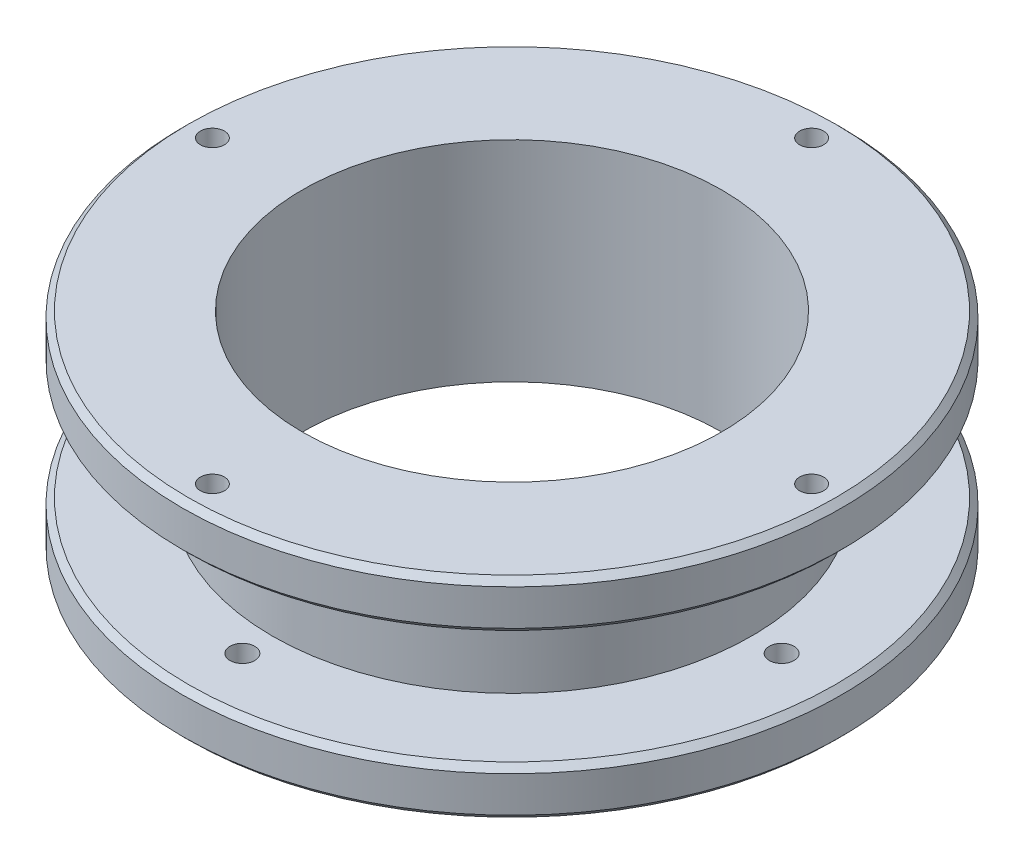
ISO-10303-21;
HEADER;
FILE_DESCRIPTION(('STEP AP214'),'2;1');
FILE_NAME('part.step','',(''),(''),'','','');
FILE_SCHEMA(('AUTOMOTIVE_DESIGN { 1 0 10303 214 1 1 1 1 }'));
ENDSEC;
DATA;
#1=APPLICATION_CONTEXT('core data for automotive mechanical design processes');
#2=APPLICATION_PROTOCOL_DEFINITION('international standard','automotive_design',2000,#1);
#3=PRODUCT_CONTEXT('',#1,'mechanical');
#4=PRODUCT('Part','Part','',(#3));
#5=PRODUCT_RELATED_PRODUCT_CATEGORY('part','',(#4));
#6=PRODUCT_DEFINITION_FORMATION('','',#4);
#7=PRODUCT_DEFINITION_CONTEXT('part definition',#1,'design');
#8=PRODUCT_DEFINITION('design','',#6,#7);
#9=PRODUCT_DEFINITION_SHAPE('','',#8);
#10=(LENGTH_UNIT() NAMED_UNIT(*) SI_UNIT(.MILLI.,.METRE.));
#11=(NAMED_UNIT(*) PLANE_ANGLE_UNIT() SI_UNIT($,.RADIAN.));
#12=(NAMED_UNIT(*) SI_UNIT($,.STERADIAN.) SOLID_ANGLE_UNIT());
#13=UNCERTAINTY_MEASURE_WITH_UNIT(LENGTH_MEASURE(1.E-05),#10,'distance_accuracy_value','');
#14=(GEOMETRIC_REPRESENTATION_CONTEXT(3) GLOBAL_UNCERTAINTY_ASSIGNED_CONTEXT((#13)) GLOBAL_UNIT_ASSIGNED_CONTEXT((#10,
#11,#12)) REPRESENTATION_CONTEXT('',''));
#15=CARTESIAN_POINT('',(0.,0.,0.));
#16=DIRECTION('',(0.,0.,1.));
#17=DIRECTION('',(1.,0.,0.));
#18=AXIS2_PLACEMENT_3D('',#15,#16,#17);
#19=CARTESIAN_POINT('',(0.,17.5,0.));
#20=DIRECTION('',(0.,-1.,0.));
#21=DIRECTION('',(0.,0.,-1.));
#22=AXIS2_PLACEMENT_3D('',#19,#20,#21);
#23=CYLINDRICAL_SURFACE('',#22,40.);
#24=CARTESIAN_POINT('',(0.,8.,0.));
#25=DIRECTION('',(0.,-1.,0.));
#26=DIRECTION('',(1.,0.,0.));
#27=AXIS2_PLACEMENT_3D('',#24,#25,#26);
#28=CIRCLE('',#27,40.);
#29=CARTESIAN_POINT('',(0.,8.,40.));
#30=VERTEX_POINT('',#29);
#31=EDGE_CURVE('E325',#30,#30,#28,.T.);
#32=ORIENTED_EDGE('',*,*,#31,.F.);
#33=DIRECTION('',(0.,1.,0.));
#34=VECTOR('',#33,1.);
#35=CARTESIAN_POINT('',(0.,17.5,40.));
#36=LINE('',#35,#34);
#37=CARTESIAN_POINT('',(0.,27.,40.));
#38=VERTEX_POINT('',#37);
#39=EDGE_CURVE('E10',#30,#38,#36,.T.);
#40=ORIENTED_EDGE('',*,*,#39,.T.);
#41=CARTESIAN_POINT('',(0.,27.,0.));
#42=DIRECTION('',(0.,-1.,0.));
#43=DIRECTION('',(1.,0.,0.));
#44=AXIS2_PLACEMENT_3D('',#41,#42,#43);
#45=CIRCLE('',#44,40.);
#46=EDGE_CURVE('E194',#38,#38,#45,.T.);
#47=ORIENTED_EDGE('',*,*,#46,.T.);
#48=ORIENTED_EDGE('',*,*,#39,.F.);
#49=EDGE_LOOP('',(#32,#40,#47,#48));
#50=FACE_BOUND('',#49,.T.);
#51=ADVANCED_FACE('F16',(#50),#23,.T.);
#52=CARTESIAN_POINT('',(0.,17.5,0.));
#53=DIRECTION('',(0.,-1.,0.));
#54=DIRECTION('',(0.,0.,-1.));
#55=AXIS2_PLACEMENT_3D('',#52,#53,#54);
#56=CYLINDRICAL_SURFACE('',#55,35.);
#57=CARTESIAN_POINT('',(0.,0.,0.));
#58=DIRECTION('',(0.,-1.,0.));
#59=DIRECTION('',(1.,0.,0.));
#60=AXIS2_PLACEMENT_3D('',#57,#58,#59);
#61=CIRCLE('',#60,35.);
#62=CARTESIAN_POINT('',(0.,0.,35.));
#63=VERTEX_POINT('',#62);
#64=EDGE_CURVE('E210',#63,#63,#61,.T.);
#65=ORIENTED_EDGE('',*,*,#64,.T.);
#66=DIRECTION('',(0.,1.,0.));
#67=VECTOR('',#66,1.);
#68=CARTESIAN_POINT('',(0.,17.5,35.));
#69=LINE('',#68,#67);
#70=CARTESIAN_POINT('',(0.,35.,35.));
#71=VERTEX_POINT('',#70);
#72=EDGE_CURVE('E26',#63,#71,#69,.T.);
#73=ORIENTED_EDGE('',*,*,#72,.T.);
#74=CARTESIAN_POINT('',(0.,35.,0.));
#75=DIRECTION('',(0.,-1.,0.));
#76=DIRECTION('',(1.,0.,0.));
#77=AXIS2_PLACEMENT_3D('',#74,#75,#76);
#78=CIRCLE('',#77,35.);
#79=EDGE_CURVE('E311',#71,#71,#78,.T.);
#80=ORIENTED_EDGE('',*,*,#79,.F.);
#81=ORIENTED_EDGE('',*,*,#72,.F.);
#82=EDGE_LOOP('',(#65,#73,#80,#81));
#83=FACE_BOUND('',#82,.T.);
#84=ADVANCED_FACE('F380',(#83),#56,.F.);
#85=CARTESIAN_POINT('',(0.,-124.45218719102,-50.));
#86=DIRECTION('',(0.,1.,0.));
#87=DIRECTION('',(1.,0.,0.));
#88=AXIS2_PLACEMENT_3D('',#85,#86,#87);
#89=CYLINDRICAL_SURFACE('',#88,2.);
#90=CARTESIAN_POINT('',(0.,35.,-50.));
#91=DIRECTION('',(0.,-1.,0.));
#92=DIRECTION('',(1.,0.,0.));
#93=AXIS2_PLACEMENT_3D('',#90,#91,#92);
#94=CIRCLE('',#93,2.);
#95=CARTESIAN_POINT('',(-2.,35.,-50.));
#96=VERTEX_POINT('',#95);
#97=EDGE_CURVE('E185',#96,#96,#94,.T.);
#98=ORIENTED_EDGE('',*,*,#97,.F.);
#99=DIRECTION('',(0.,-1.,0.));
#100=VECTOR('',#99,1.);
#101=CARTESIAN_POINT('',(-2.,-124.45218719102,-50.));
#102=LINE('',#101,#100);
#103=CARTESIAN_POINT('',(-2.,27.,-50.));
#104=VERTEX_POINT('',#103);
#105=EDGE_CURVE('E180',#96,#104,#102,.T.);
#106=ORIENTED_EDGE('',*,*,#105,.T.);
#107=CARTESIAN_POINT('',(0.,27.,-50.));
#108=DIRECTION('',(0.,1.,0.));
#109=DIRECTION('',(1.,0.,0.));
#110=AXIS2_PLACEMENT_3D('',#107,#108,#109);
#111=CIRCLE('',#110,2.);
#112=EDGE_CURVE('E183',#104,#104,#111,.T.);
#113=ORIENTED_EDGE('',*,*,#112,.F.);
#114=ORIENTED_EDGE('',*,*,#105,.F.);
#115=EDGE_LOOP('',(#98,#106,#113,#114));
#116=FACE_BOUND('',#115,.T.);
#117=ADVANCED_FACE('F182',(#116),#89,.F.);
#118=CARTESIAN_POINT('',(0.,-124.45218719102,50.));
#119=DIRECTION('',(0.,1.,0.));
#120=DIRECTION('',(1.,0.,0.));
#121=AXIS2_PLACEMENT_3D('',#118,#119,#120);
#122=CYLINDRICAL_SURFACE('',#121,2.);
#123=CARTESIAN_POINT('',(0.,35.,50.));
#124=DIRECTION('',(0.,-1.,0.));
#125=DIRECTION('',(1.,0.,0.));
#126=AXIS2_PLACEMENT_3D('',#123,#124,#125);
#127=CIRCLE('',#126,2.);
#128=CARTESIAN_POINT('',(-2.,35.,50.));
#129=VERTEX_POINT('',#128);
#130=EDGE_CURVE('E278',#129,#129,#127,.T.);
#131=ORIENTED_EDGE('',*,*,#130,.F.);
#132=DIRECTION('',(0.,-1.,0.));
#133=VECTOR('',#132,1.);
#134=CARTESIAN_POINT('',(-2.,-124.45218719102,50.));
#135=LINE('',#134,#133);
#136=CARTESIAN_POINT('',(-2.,27.,50.));
#137=VERTEX_POINT('',#136);
#138=EDGE_CURVE('E187',#129,#137,#135,.T.);
#139=ORIENTED_EDGE('',*,*,#138,.T.);
#140=CARTESIAN_POINT('',(0.,27.,50.));
#141=DIRECTION('',(0.,1.,0.));
#142=DIRECTION('',(1.,0.,0.));
#143=AXIS2_PLACEMENT_3D('',#140,#141,#142);
#144=CIRCLE('',#143,2.);
#145=EDGE_CURVE('E193',#137,#137,#144,.T.);
#146=ORIENTED_EDGE('',*,*,#145,.F.);
#147=ORIENTED_EDGE('',*,*,#138,.F.);
#148=EDGE_LOOP('',(#131,#139,#146,#147));
#149=FACE_BOUND('',#148,.T.);
#150=ADVANCED_FACE('F435',(#149),#122,.F.);
#151=CARTESIAN_POINT('',(-50.,-124.45218719102,0.));
#152=DIRECTION('',(0.,1.,0.));
#153=DIRECTION('',(1.,0.,0.));
#154=AXIS2_PLACEMENT_3D('',#151,#152,#153);
#155=CYLINDRICAL_SURFACE('',#154,2.);
#156=CARTESIAN_POINT('',(-50.,35.,0.));
#157=DIRECTION('',(0.,-1.,0.));
#158=DIRECTION('',(1.,0.,0.));
#159=AXIS2_PLACEMENT_3D('',#156,#157,#158);
#160=CIRCLE('',#159,2.);
#161=CARTESIAN_POINT('',(-52.,35.,0.));
#162=VERTEX_POINT('',#161);
#163=EDGE_CURVE('E208',#162,#162,#160,.T.);
#164=ORIENTED_EDGE('',*,*,#163,.F.);
#165=DIRECTION('',(0.,-1.,0.));
#166=VECTOR('',#165,1.);
#167=CARTESIAN_POINT('',(-52.,-124.45218719102,0.));
#168=LINE('',#167,#166);
#169=CARTESIAN_POINT('',(-52.,27.,0.));
#170=VERTEX_POINT('',#169);
#171=EDGE_CURVE('E294',#162,#170,#168,.T.);
#172=ORIENTED_EDGE('',*,*,#171,.T.);
#173=CARTESIAN_POINT('',(-50.,27.,0.));
#174=DIRECTION('',(0.,1.,0.));
#175=DIRECTION('',(1.,0.,0.));
#176=AXIS2_PLACEMENT_3D('',#173,#174,#175);
#177=CIRCLE('',#176,2.);
#178=EDGE_CURVE('E202',#170,#170,#177,.T.);
#179=ORIENTED_EDGE('',*,*,#178,.F.);
#180=ORIENTED_EDGE('',*,*,#171,.F.);
#181=EDGE_LOOP('',(#164,#172,#179,#180));
#182=FACE_BOUND('',#181,.T.);
#183=ADVANCED_FACE('F428',(#182),#155,.F.);
#184=CARTESIAN_POINT('',(50.,-124.45218719102,0.));
#185=DIRECTION('',(0.,1.,0.));
#186=DIRECTION('',(1.,0.,0.));
#187=AXIS2_PLACEMENT_3D('',#184,#185,#186);
#188=CYLINDRICAL_SURFACE('',#187,2.);
#189=CARTESIAN_POINT('',(50.,35.,0.));
#190=DIRECTION('',(0.,-1.,0.));
#191=DIRECTION('',(1.,0.,0.));
#192=AXIS2_PLACEMENT_3D('',#189,#190,#191);
#193=CIRCLE('',#192,2.);
#194=CARTESIAN_POINT('',(48.,35.,0.));
#195=VERTEX_POINT('',#194);
#196=EDGE_CURVE('E290',#195,#195,#193,.T.);
#197=ORIENTED_EDGE('',*,*,#196,.F.);
#198=DIRECTION('',(0.,-1.,0.));
#199=VECTOR('',#198,1.);
#200=CARTESIAN_POINT('',(48.,-124.45218719102,0.));
#201=LINE('',#200,#199);
#202=CARTESIAN_POINT('',(48.,27.,0.));
#203=VERTEX_POINT('',#202);
#204=EDGE_CURVE('E40',#195,#203,#201,.T.);
#205=ORIENTED_EDGE('',*,*,#204,.T.);
#206=CARTESIAN_POINT('',(50.,27.,0.));
#207=DIRECTION('',(0.,1.,0.));
#208=DIRECTION('',(1.,0.,0.));
#209=AXIS2_PLACEMENT_3D('',#206,#207,#208);
#210=CIRCLE('',#209,2.);
#211=EDGE_CURVE('E324',#203,#203,#210,.T.);
#212=ORIENTED_EDGE('',*,*,#211,.F.);
#213=ORIENTED_EDGE('',*,*,#204,.F.);
#214=EDGE_LOOP('',(#197,#205,#212,#213));
#215=FACE_BOUND('',#214,.T.);
#216=ADVANCED_FACE('F425',(#215),#188,.F.);
#217=CARTESIAN_POINT('',(0.,159.45218719102,45.));
#218=DIRECTION('',(0.,-1.,0.));
#219=DIRECTION('',(1.,0.,0.));
#220=AXIS2_PLACEMENT_3D('',#217,#218,#219);
#221=CYLINDRICAL_SURFACE('',#220,2.067);
#222=CARTESIAN_POINT('',(0.,0.,45.));
#223=DIRECTION('',(0.,1.,0.));
#224=DIRECTION('',(1.,0.,0.));
#225=AXIS2_PLACEMENT_3D('',#222,#223,#224);
#226=CIRCLE('',#225,2.067);
#227=CARTESIAN_POINT('',(-2.067,0.,45.));
#228=VERTEX_POINT('',#227);
#229=EDGE_CURVE('E212',#228,#228,#226,.T.);
#230=ORIENTED_EDGE('',*,*,#229,.F.);
#231=DIRECTION('',(0.,1.,0.));
#232=VECTOR('',#231,1.);
#233=CARTESIAN_POINT('',(-2.067,159.45218719102,45.));
#234=LINE('',#233,#232);
#235=CARTESIAN_POINT('',(-2.067,8.,45.));
#236=VERTEX_POINT('',#235);
#237=EDGE_CURVE('E250',#228,#236,#234,.T.);
#238=ORIENTED_EDGE('',*,*,#237,.T.);
#239=CARTESIAN_POINT('',(0.,8.,45.));
#240=DIRECTION('',(0.,-1.,0.));
#241=DIRECTION('',(1.,0.,0.));
#242=AXIS2_PLACEMENT_3D('',#239,#240,#241);
#243=CIRCLE('',#242,2.067);
#244=EDGE_CURVE('E287',#236,#236,#243,.T.);
#245=ORIENTED_EDGE('',*,*,#244,.F.);
#246=ORIENTED_EDGE('',*,*,#237,.F.);
#247=EDGE_LOOP('',(#230,#238,#245,#246));
#248=FACE_BOUND('',#247,.T.);
#249=ADVANCED_FACE('F427',(#248),#221,.F.);
#250=CARTESIAN_POINT('',(0.,159.45218719102,-45.));
#251=DIRECTION('',(0.,-1.,0.));
#252=DIRECTION('',(1.,0.,0.));
#253=AXIS2_PLACEMENT_3D('',#250,#251,#252);
#254=CYLINDRICAL_SURFACE('',#253,2.067);
#255=CARTESIAN_POINT('',(0.,0.,-45.));
#256=DIRECTION('',(0.,1.,0.));
#257=DIRECTION('',(1.,0.,0.));
#258=AXIS2_PLACEMENT_3D('',#255,#256,#257);
#259=CIRCLE('',#258,2.067);
#260=CARTESIAN_POINT('',(-2.067,0.,-45.));
#261=VERTEX_POINT('',#260);
#262=EDGE_CURVE('E220',#261,#261,#259,.T.);
#263=ORIENTED_EDGE('',*,*,#262,.F.);
#264=DIRECTION('',(0.,1.,0.));
#265=VECTOR('',#264,1.);
#266=CARTESIAN_POINT('',(-2.067,159.45218719102,-45.));
#267=LINE('',#266,#265);
#268=CARTESIAN_POINT('',(-2.067,8.,-45.));
#269=VERTEX_POINT('',#268);
#270=EDGE_CURVE('E248',#261,#269,#267,.T.);
#271=ORIENTED_EDGE('',*,*,#270,.T.);
#272=CARTESIAN_POINT('',(0.,8.,-45.));
#273=DIRECTION('',(0.,-1.,0.));
#274=DIRECTION('',(1.,0.,0.));
#275=AXIS2_PLACEMENT_3D('',#272,#273,#274);
#276=CIRCLE('',#275,2.067);
#277=EDGE_CURVE('E282',#269,#269,#276,.T.);
#278=ORIENTED_EDGE('',*,*,#277,.F.);
#279=ORIENTED_EDGE('',*,*,#270,.F.);
#280=EDGE_LOOP('',(#263,#271,#278,#279));
#281=FACE_BOUND('',#280,.T.);
#282=ADVANCED_FACE('F423',(#281),#254,.F.);
#283=CARTESIAN_POINT('',(-45.,159.45218719102,0.));
#284=DIRECTION('',(0.,-1.,0.));
#285=DIRECTION('',(1.,0.,0.));
#286=AXIS2_PLACEMENT_3D('',#283,#284,#285);
#287=CYLINDRICAL_SURFACE('',#286,2.067);
#288=CARTESIAN_POINT('',(-45.,0.,0.));
#289=DIRECTION('',(0.,1.,0.));
#290=DIRECTION('',(1.,0.,0.));
#291=AXIS2_PLACEMENT_3D('',#288,#289,#290);
#292=CIRCLE('',#291,2.067);
#293=CARTESIAN_POINT('',(-47.067,0.,0.));
#294=VERTEX_POINT('',#293);
#295=EDGE_CURVE('E240',#294,#294,#292,.T.);
#296=ORIENTED_EDGE('',*,*,#295,.F.);
#297=DIRECTION('',(0.,1.,0.));
#298=VECTOR('',#297,1.);
#299=CARTESIAN_POINT('',(-47.067,159.45218719102,0.));
#300=LINE('',#299,#298);
#301=CARTESIAN_POINT('',(-47.067,8.,0.));
#302=VERTEX_POINT('',#301);
#303=EDGE_CURVE('E235',#294,#302,#300,.T.);
#304=ORIENTED_EDGE('',*,*,#303,.T.);
#305=CARTESIAN_POINT('',(-45.,8.,0.));
#306=DIRECTION('',(0.,-1.,0.));
#307=DIRECTION('',(1.,0.,0.));
#308=AXIS2_PLACEMENT_3D('',#305,#306,#307);
#309=CIRCLE('',#308,2.067);
#310=EDGE_CURVE('E286',#302,#302,#309,.T.);
#311=ORIENTED_EDGE('',*,*,#310,.F.);
#312=ORIENTED_EDGE('',*,*,#303,.F.);
#313=EDGE_LOOP('',(#296,#304,#311,#312));
#314=FACE_BOUND('',#313,.T.);
#315=ADVANCED_FACE('F420',(#314),#287,.F.);
#316=CARTESIAN_POINT('',(45.,159.45218719102,0.));
#317=DIRECTION('',(0.,-1.,0.));
#318=DIRECTION('',(1.,0.,0.));
#319=AXIS2_PLACEMENT_3D('',#316,#317,#318);
#320=CYLINDRICAL_SURFACE('',#319,2.067);
#321=CARTESIAN_POINT('',(45.,0.,0.));
#322=DIRECTION('',(0.,1.,0.));
#323=DIRECTION('',(1.,0.,0.));
#324=AXIS2_PLACEMENT_3D('',#321,#322,#323);
#325=CIRCLE('',#324,2.067);
#326=CARTESIAN_POINT('',(42.933,0.,0.));
#327=VERTEX_POINT('',#326);
#328=EDGE_CURVE('E269',#327,#327,#325,.T.);
#329=ORIENTED_EDGE('',*,*,#328,.F.);
#330=DIRECTION('',(0.,1.,0.));
#331=VECTOR('',#330,1.);
#332=CARTESIAN_POINT('',(42.933,159.45218719102,0.));
#333=LINE('',#332,#331);
#334=CARTESIAN_POINT('',(42.933,8.,0.));
#335=VERTEX_POINT('',#334);
#336=EDGE_CURVE('E288',#327,#335,#333,.T.);
#337=ORIENTED_EDGE('',*,*,#336,.T.);
#338=CARTESIAN_POINT('',(45.,8.,0.));
#339=DIRECTION('',(0.,-1.,0.));
#340=DIRECTION('',(1.,0.,0.));
#341=AXIS2_PLACEMENT_3D('',#338,#339,#340);
#342=CIRCLE('',#341,2.067);
#343=EDGE_CURVE('E257',#335,#335,#342,.T.);
#344=ORIENTED_EDGE('',*,*,#343,.F.);
#345=ORIENTED_EDGE('',*,*,#336,.F.);
#346=EDGE_LOOP('',(#329,#337,#344,#345));
#347=FACE_BOUND('',#346,.T.);
#348=ADVANCED_FACE('F422',(#347),#320,.F.);
#349=CARTESIAN_POINT('',(0.,35.,-55.));
#350=DIRECTION('',(0.,1.,0.));
#351=DIRECTION('',(1.,0.,0.));
#352=AXIS2_PLACEMENT_3D('',#349,#350,#351);
#353=PLANE('',#352);
#354=ORIENTED_EDGE('',*,*,#196,.T.);
#355=EDGE_LOOP('',(#354));
#356=FACE_BOUND('',#355,.T.);
#357=ORIENTED_EDGE('',*,*,#163,.T.);
#358=EDGE_LOOP('',(#357));
#359=FACE_BOUND('',#358,.T.);
#360=ORIENTED_EDGE('',*,*,#130,.T.);
#361=EDGE_LOOP('',(#360));
#362=FACE_BOUND('',#361,.T.);
#363=ORIENTED_EDGE('',*,*,#97,.T.);
#364=EDGE_LOOP('',(#363));
#365=FACE_BOUND('',#364,.T.);
#366=ORIENTED_EDGE('',*,*,#79,.T.);
#367=EDGE_LOOP('',(#366));
#368=FACE_BOUND('',#367,.T.);
#369=CARTESIAN_POINT('',(0.,35.,0.));
#370=DIRECTION('',(0.,-1.,0.));
#371=DIRECTION('',(0.,0.,1.));
#372=AXIS2_PLACEMENT_3D('',#369,#370,#371);
#373=CIRCLE('',#372,54.);
#374=CARTESIAN_POINT('',(0.,35.,-54.));
#375=VERTEX_POINT('',#374);
#376=EDGE_CURVE('E94',#375,#375,#373,.T.);
#377=ORIENTED_EDGE('',*,*,#376,.F.);
#378=EDGE_LOOP('',(#377));
#379=FACE_BOUND('',#378,.T.);
#380=ADVANCED_FACE('F374',(#356,#359,#362,#365,#368,#379),#353,.T.);
#381=CARTESIAN_POINT('',(0.,34.5,0.));
#382=DIRECTION('',(0.,-1.,0.));
#383=DIRECTION('',(0.,0.,1.));
#384=AXIS2_PLACEMENT_3D('',#381,#382,#383);
#385=CONICAL_SURFACE('',#384,54.5,0.785398163397451);
#386=CARTESIAN_POINT('',(0.,34.,0.));
#387=DIRECTION('',(0.,1.,0.));
#388=DIRECTION('',(0.,0.,1.));
#389=AXIS2_PLACEMENT_3D('',#386,#387,#388);
#390=CIRCLE('',#389,55.);
#391=CARTESIAN_POINT('',(0.,34.,-55.));
#392=VERTEX_POINT('',#391);
#393=CARTESIAN_POINT('',(0.,34.,55.));
#394=VERTEX_POINT('',#393);
#395=EDGE_CURVE('E247',#392,#394,#390,.T.);
#396=ORIENTED_EDGE('',*,*,#395,.T.);
#397=CARTESIAN_POINT('',(0.,34.,0.));
#398=DIRECTION('',(0.,1.,0.));
#399=DIRECTION('',(0.,0.,1.));
#400=AXIS2_PLACEMENT_3D('',#397,#398,#399);
#401=CIRCLE('',#400,55.);
#402=EDGE_CURVE('E205',#394,#392,#401,.T.);
#403=ORIENTED_EDGE('',*,*,#402,.T.);
#404=DIRECTION('',(0.,0.707106781186546,0.707106781186549));
#405=VECTOR('',#404,1.);
#406=CARTESIAN_POINT('',(0.,34.5,-54.5));
#407=LINE('',#406,#405);
#408=EDGE_CURVE('E19',#392,#375,#407,.T.);
#409=ORIENTED_EDGE('',*,*,#408,.T.);
#410=ORIENTED_EDGE('',*,*,#376,.T.);
#411=ORIENTED_EDGE('',*,*,#408,.F.);
#412=EDGE_LOOP('',(#396,#403,#409,#410,#411));
#413=FACE_BOUND('',#412,.T.);
#414=ADVANCED_FACE('F355',(#413),#385,.T.);
#415=CARTESIAN_POINT('',(0.,27.,-40.));
#416=DIRECTION('',(0.,-1.,0.));
#417=DIRECTION('',(0.,0.,-1.));
#418=AXIS2_PLACEMENT_3D('',#415,#416,#417);
#419=PLANE('',#418);
#420=ORIENTED_EDGE('',*,*,#211,.T.);
#421=EDGE_LOOP('',(#420));
#422=FACE_BOUND('',#421,.T.);
#423=ORIENTED_EDGE('',*,*,#178,.T.);
#424=EDGE_LOOP('',(#423));
#425=FACE_BOUND('',#424,.T.);
#426=ORIENTED_EDGE('',*,*,#145,.T.);
#427=EDGE_LOOP('',(#426));
#428=FACE_BOUND('',#427,.T.);
#429=ORIENTED_EDGE('',*,*,#112,.T.);
#430=EDGE_LOOP('',(#429));
#431=FACE_BOUND('',#430,.T.);
#432=ORIENTED_EDGE('',*,*,#46,.F.);
#433=EDGE_LOOP('',(#432));
#434=FACE_BOUND('',#433,.T.);
#435=CARTESIAN_POINT('',(0.,27.,0.));
#436=DIRECTION('',(0.,1.,0.));
#437=DIRECTION('',(0.,0.,1.));
#438=AXIS2_PLACEMENT_3D('',#435,#436,#437);
#439=CIRCLE('',#438,54.);
#440=CARTESIAN_POINT('',(0.,27.,-54.));
#441=VERTEX_POINT('',#440);
#442=EDGE_CURVE('E252',#441,#441,#439,.T.);
#443=ORIENTED_EDGE('',*,*,#442,.F.);
#444=EDGE_LOOP('',(#443));
#445=FACE_BOUND('',#444,.T.);
#446=ADVANCED_FACE('F190',(#422,#425,#428,#431,#434,#445),#419,.T.);
#447=CARTESIAN_POINT('',(0.,31.,0.));
#448=DIRECTION('',(0.,-1.,0.));
#449=DIRECTION('',(0.,0.,-1.));
#450=AXIS2_PLACEMENT_3D('',#447,#448,#449);
#451=CYLINDRICAL_SURFACE('',#450,55.);
#452=CARTESIAN_POINT('',(0.,28.,0.));
#453=DIRECTION('',(0.,-1.,0.));
#454=DIRECTION('',(0.,0.,1.));
#455=AXIS2_PLACEMENT_3D('',#452,#453,#454);
#456=CIRCLE('',#455,55.);
#457=CARTESIAN_POINT('',(0.,28.,-55.));
#458=VERTEX_POINT('',#457);
#459=CARTESIAN_POINT('',(0.,28.,55.));
#460=VERTEX_POINT('',#459);
#461=EDGE_CURVE('E306',#458,#460,#456,.T.);
#462=ORIENTED_EDGE('',*,*,#461,.F.);
#463=CARTESIAN_POINT('',(0.,28.,0.));
#464=DIRECTION('',(0.,-1.,0.));
#465=DIRECTION('',(0.,0.,1.));
#466=AXIS2_PLACEMENT_3D('',#463,#464,#465);
#467=CIRCLE('',#466,55.);
#468=EDGE_CURVE('E310',#460,#458,#467,.T.);
#469=ORIENTED_EDGE('',*,*,#468,.F.);
#470=DIRECTION('',(0.,1.,0.));
#471=VECTOR('',#470,1.);
#472=CARTESIAN_POINT('',(0.,31.,55.));
#473=LINE('',#472,#471);
#474=EDGE_CURVE('E314',#460,#394,#473,.T.);
#475=ORIENTED_EDGE('',*,*,#474,.T.);
#476=ORIENTED_EDGE('',*,*,#395,.F.);
#477=ORIENTED_EDGE('',*,*,#402,.F.);
#478=ORIENTED_EDGE('',*,*,#474,.F.);
#479=EDGE_LOOP('',(#462,#469,#475,#476,#477,#478));
#480=FACE_BOUND('',#479,.T.);
#481=ADVANCED_FACE('F360',(#480),#451,.T.);
#482=CARTESIAN_POINT('',(0.,27.5,0.));
#483=DIRECTION('',(0.,1.,0.));
#484=DIRECTION('',(0.,0.,1.));
#485=AXIS2_PLACEMENT_3D('',#482,#483,#484);
#486=CONICAL_SURFACE('',#485,54.5,0.785398163397446);
#487=ORIENTED_EDGE('',*,*,#442,.T.);
#488=DIRECTION('',(0.,0.707106781186549,-0.707106781186546));
#489=VECTOR('',#488,1.);
#490=CARTESIAN_POINT('',(0.,27.5,-54.5));
#491=LINE('',#490,#489);
#492=EDGE_CURVE('E256',#441,#458,#491,.T.);
#493=ORIENTED_EDGE('',*,*,#492,.T.);
#494=ORIENTED_EDGE('',*,*,#461,.T.);
#495=ORIENTED_EDGE('',*,*,#468,.T.);
#496=ORIENTED_EDGE('',*,*,#492,.F.);
#497=EDGE_LOOP('',(#487,#493,#494,#495,#496));
#498=FACE_BOUND('',#497,.T.);
#499=ADVANCED_FACE('F362',(#498),#486,.T.);
#500=CARTESIAN_POINT('',(0.,8.,-55.));
#501=DIRECTION('',(0.,1.,0.));
#502=DIRECTION('',(1.,0.,0.));
#503=AXIS2_PLACEMENT_3D('',#500,#501,#502);
#504=PLANE('',#503);
#505=ORIENTED_EDGE('',*,*,#343,.T.);
#506=EDGE_LOOP('',(#505));
#507=FACE_BOUND('',#506,.T.);
#508=ORIENTED_EDGE('',*,*,#310,.T.);
#509=EDGE_LOOP('',(#508));
#510=FACE_BOUND('',#509,.T.);
#511=ORIENTED_EDGE('',*,*,#277,.T.);
#512=EDGE_LOOP('',(#511));
#513=FACE_BOUND('',#512,.T.);
#514=ORIENTED_EDGE('',*,*,#244,.T.);
#515=EDGE_LOOP('',(#514));
#516=FACE_BOUND('',#515,.T.);
#517=ORIENTED_EDGE('',*,*,#31,.T.);
#518=EDGE_LOOP('',(#517));
#519=FACE_BOUND('',#518,.T.);
#520=CARTESIAN_POINT('',(0.,8.,0.));
#521=DIRECTION('',(0.,-1.,0.));
#522=DIRECTION('',(0.,0.,1.));
#523=AXIS2_PLACEMENT_3D('',#520,#521,#522);
#524=CIRCLE('',#523,54.);
#525=CARTESIAN_POINT('',(0.,8.,-54.));
#526=VERTEX_POINT('',#525);
#527=EDGE_CURVE('E275',#526,#526,#524,.T.);
#528=ORIENTED_EDGE('',*,*,#527,.F.);
#529=EDGE_LOOP('',(#528));
#530=FACE_BOUND('',#529,.T.);
#531=ADVANCED_FACE('F389',(#507,#510,#513,#516,#519,#530),#504,.T.);
#532=CARTESIAN_POINT('',(0.,7.5,0.));
#533=DIRECTION('',(0.,-1.,0.));
#534=DIRECTION('',(0.,0.,1.));
#535=AXIS2_PLACEMENT_3D('',#532,#533,#534);
#536=CONICAL_SURFACE('',#535,54.5,0.785398163397447);
#537=CARTESIAN_POINT('',(0.,7.,0.));
#538=DIRECTION('',(0.,1.,0.));
#539=DIRECTION('',(0.,0.,1.));
#540=AXIS2_PLACEMENT_3D('',#537,#538,#539);
#541=CIRCLE('',#540,55.);
#542=CARTESIAN_POINT('',(0.,7.,-55.));
#543=VERTEX_POINT('',#542);
#544=CARTESIAN_POINT('',(0.,7.,55.));
#545=VERTEX_POINT('',#544);
#546=EDGE_CURVE('E223',#543,#545,#541,.T.);
#547=ORIENTED_EDGE('',*,*,#546,.T.);
#548=CARTESIAN_POINT('',(0.,7.,0.));
#549=DIRECTION('',(0.,1.,0.));
#550=DIRECTION('',(0.,0.,1.));
#551=AXIS2_PLACEMENT_3D('',#548,#549,#550);
#552=CIRCLE('',#551,55.);
#553=EDGE_CURVE('E213',#545,#543,#552,.T.);
#554=ORIENTED_EDGE('',*,*,#553,.T.);
#555=DIRECTION('',(0.,0.707106781186549,0.707106781186546));
#556=VECTOR('',#555,1.);
#557=CARTESIAN_POINT('',(0.,7.5,-54.5));
#558=LINE('',#557,#556);
#559=EDGE_CURVE('E272',#543,#526,#558,.T.);
#560=ORIENTED_EDGE('',*,*,#559,.T.);
#561=ORIENTED_EDGE('',*,*,#527,.T.);
#562=ORIENTED_EDGE('',*,*,#559,.F.);
#563=EDGE_LOOP('',(#547,#554,#560,#561,#562));
#564=FACE_BOUND('',#563,.T.);
#565=ADVANCED_FACE('F392',(#564),#536,.T.);
#566=CARTESIAN_POINT('',(0.,0.,-35.));
#567=DIRECTION('',(0.,-1.,0.));
#568=DIRECTION('',(0.,0.,-1.));
#569=AXIS2_PLACEMENT_3D('',#566,#567,#568);
#570=PLANE('',#569);
#571=ORIENTED_EDGE('',*,*,#328,.T.);
#572=EDGE_LOOP('',(#571));
#573=FACE_BOUND('',#572,.T.);
#574=ORIENTED_EDGE('',*,*,#295,.T.);
#575=EDGE_LOOP('',(#574));
#576=FACE_BOUND('',#575,.T.);
#577=ORIENTED_EDGE('',*,*,#262,.T.);
#578=EDGE_LOOP('',(#577));
#579=FACE_BOUND('',#578,.T.);
#580=ORIENTED_EDGE('',*,*,#229,.T.);
#581=EDGE_LOOP('',(#580));
#582=FACE_BOUND('',#581,.T.);
#583=ORIENTED_EDGE('',*,*,#64,.F.);
#584=EDGE_LOOP('',(#583));
#585=FACE_BOUND('',#584,.T.);
#586=CARTESIAN_POINT('',(0.,0.,0.));
#587=DIRECTION('',(0.,1.,0.));
#588=DIRECTION('',(0.,0.,1.));
#589=AXIS2_PLACEMENT_3D('',#586,#587,#588);
#590=CIRCLE('',#589,54.);
#591=CARTESIAN_POINT('',(0.,0.,-54.));
#592=VERTEX_POINT('',#591);
#593=EDGE_CURVE('E262',#592,#592,#590,.T.);
#594=ORIENTED_EDGE('',*,*,#593,.F.);
#595=EDGE_LOOP('',(#594));
#596=FACE_BOUND('',#595,.T.);
#597=ADVANCED_FACE('F405',(#573,#576,#579,#582,#585,#596),#570,.T.);
#598=CARTESIAN_POINT('',(0.,4.,0.));
#599=DIRECTION('',(0.,-1.,0.));
#600=DIRECTION('',(0.,0.,-1.));
#601=AXIS2_PLACEMENT_3D('',#598,#599,#600);
#602=CYLINDRICAL_SURFACE('',#601,55.);
#603=CARTESIAN_POINT('',(0.,1.,0.));
#604=DIRECTION('',(0.,-1.,0.));
#605=DIRECTION('',(0.,0.,1.));
#606=AXIS2_PLACEMENT_3D('',#603,#604,#605);
#607=CIRCLE('',#606,55.);
#608=CARTESIAN_POINT('',(0.,1.,-55.));
#609=VERTEX_POINT('',#608);
#610=CARTESIAN_POINT('',(0.,1.,55.));
#611=VERTEX_POINT('',#610);
#612=EDGE_CURVE('E261',#609,#611,#607,.T.);
#613=ORIENTED_EDGE('',*,*,#612,.F.);
#614=CARTESIAN_POINT('',(0.,1.,0.));
#615=DIRECTION('',(0.,-1.,0.));
#616=DIRECTION('',(0.,0.,1.));
#617=AXIS2_PLACEMENT_3D('',#614,#615,#616);
#618=CIRCLE('',#617,55.);
#619=EDGE_CURVE('E119',#611,#609,#618,.T.);
#620=ORIENTED_EDGE('',*,*,#619,.F.);
#621=DIRECTION('',(0.,1.,0.));
#622=VECTOR('',#621,1.);
#623=CARTESIAN_POINT('',(0.,4.,55.));
#624=LINE('',#623,#622);
#625=EDGE_CURVE('E232',#611,#545,#624,.T.);
#626=ORIENTED_EDGE('',*,*,#625,.T.);
#627=ORIENTED_EDGE('',*,*,#546,.F.);
#628=ORIENTED_EDGE('',*,*,#553,.F.);
#629=ORIENTED_EDGE('',*,*,#625,.F.);
#630=EDGE_LOOP('',(#613,#620,#626,#627,#628,#629));
#631=FACE_BOUND('',#630,.T.);
#632=ADVANCED_FACE('F401',(#631),#602,.T.);
#633=CARTESIAN_POINT('',(0.,0.5,0.));
#634=DIRECTION('',(0.,1.,0.));
#635=DIRECTION('',(0.,0.,1.));
#636=AXIS2_PLACEMENT_3D('',#633,#634,#635);
#637=CONICAL_SURFACE('',#636,54.5,0.785398163397447);
#638=ORIENTED_EDGE('',*,*,#593,.T.);
#639=DIRECTION('',(0.,0.707106781186549,-0.707106781186546));
#640=VECTOR('',#639,1.);
#641=CARTESIAN_POINT('',(0.,0.5,-54.5));
#642=LINE('',#641,#640);
#643=EDGE_CURVE('E111',#592,#609,#642,.T.);
#644=ORIENTED_EDGE('',*,*,#643,.T.);
#645=ORIENTED_EDGE('',*,*,#612,.T.);
#646=ORIENTED_EDGE('',*,*,#619,.T.);
#647=ORIENTED_EDGE('',*,*,#643,.F.);
#648=EDGE_LOOP('',(#638,#644,#645,#646,#647));
#649=FACE_BOUND('',#648,.T.);
#650=ADVANCED_FACE('F402',(#649),#637,.T.);
#651=CLOSED_SHELL('',(#51,#84,#117,#150,#183,#216,#249,#282,#315,#348,#380,#414,#446,#481,#499,
#531,#565,#597,#632,#650));
#652=MANIFOLD_SOLID_BREP('B1',#651);
#653=ADVANCED_BREP_SHAPE_REPRESENTATION('',(#18,#652),#14);
#654=SHAPE_DEFINITION_REPRESENTATION(#9,#653);
ENDSEC;
END-ISO-10303-21;
